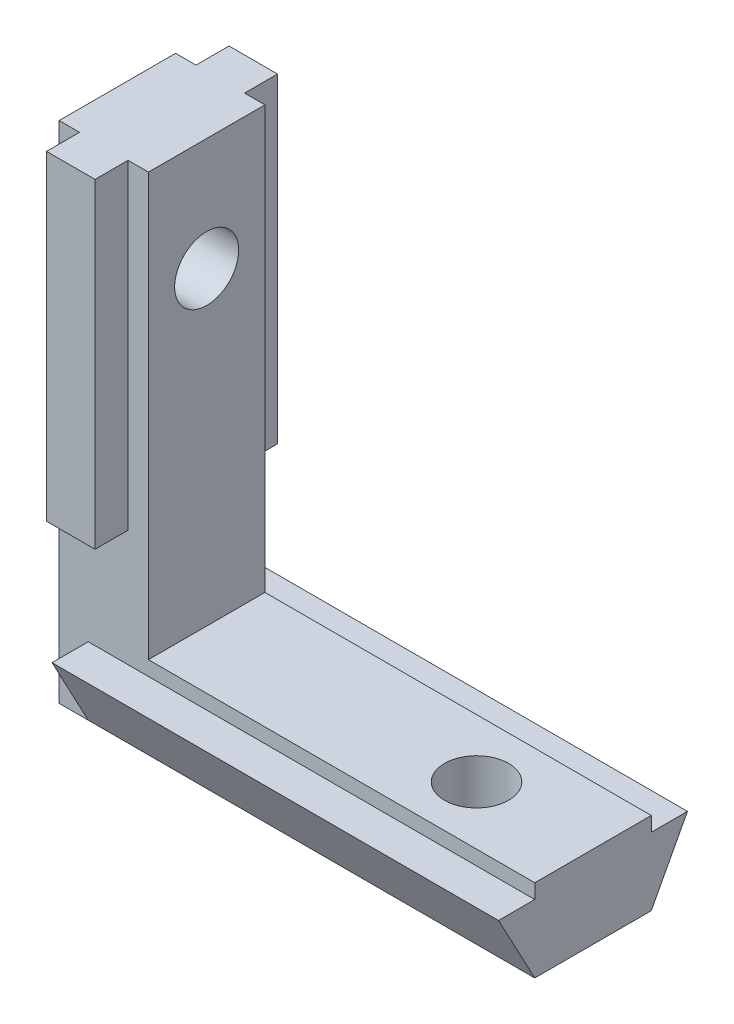
ISO-10303-21;
HEADER;
FILE_DESCRIPTION(('STEP AP214'),'2;1');
FILE_NAME('part.step','',(''),(''),'','','');
FILE_SCHEMA(('AUTOMOTIVE_DESIGN { 1 0 10303 214 1 1 1 1 }'));
ENDSEC;
DATA;
#1=APPLICATION_CONTEXT('core data for automotive mechanical design processes');
#2=APPLICATION_PROTOCOL_DEFINITION('international standard','automotive_design',2000,#1);
#3=PRODUCT_CONTEXT('',#1,'mechanical');
#4=PRODUCT('Part','Part','',(#3));
#5=PRODUCT_RELATED_PRODUCT_CATEGORY('part','',(#4));
#6=PRODUCT_DEFINITION_FORMATION('','',#4);
#7=PRODUCT_DEFINITION_CONTEXT('part definition',#1,'design');
#8=PRODUCT_DEFINITION('design','',#6,#7);
#9=PRODUCT_DEFINITION_SHAPE('','',#8);
#10=(LENGTH_UNIT() NAMED_UNIT(*) SI_UNIT(.MILLI.,.METRE.));
#11=(NAMED_UNIT(*) PLANE_ANGLE_UNIT() SI_UNIT($,.RADIAN.));
#12=(NAMED_UNIT(*) SI_UNIT($,.STERADIAN.) SOLID_ANGLE_UNIT());
#13=UNCERTAINTY_MEASURE_WITH_UNIT(LENGTH_MEASURE(1.E-05),#10,'distance_accuracy_value','');
#14=(GEOMETRIC_REPRESENTATION_CONTEXT(3) GLOBAL_UNCERTAINTY_ASSIGNED_CONTEXT((#13)) GLOBAL_UNIT_ASSIGNED_CONTEXT((#10,
#11,#12)) REPRESENTATION_CONTEXT('',''));
#15=CARTESIAN_POINT('',(0.,0.,0.));
#16=DIRECTION('',(0.,0.,1.));
#17=DIRECTION('',(1.,0.,0.));
#18=AXIS2_PLACEMENT_3D('',#15,#16,#17);
#19=CARTESIAN_POINT('',(25.5,4.25,3.));
#20=DIRECTION('',(0.,-1.,0.));
#21=DIRECTION('',(1.,0.,0.));
#22=AXIS2_PLACEMENT_3D('',#19,#20,#21);
#23=PLANE('',#22);
#24=DIRECTION('',(-1.,0.,0.));
#25=VECTOR('',#24,1.);
#26=CARTESIAN_POINT('',(25.5,4.25,-3.));
#27=LINE('',#26,#25);
#28=CARTESIAN_POINT('',(24.5,4.25,-3.));
#29=VERTEX_POINT('',#28);
#30=CARTESIAN_POINT('',(4.6,4.25,-3.));
#31=VERTEX_POINT('',#30);
#32=EDGE_CURVE('E223',#29,#31,#27,.T.);
#33=ORIENTED_EDGE('',*,*,#32,.T.);
#34=DIRECTION('',(0.,0.,-1.));
#35=VECTOR('',#34,1.);
#36=CARTESIAN_POINT('',(4.6,4.25,5.2));
#37=LINE('',#36,#35);
#38=CARTESIAN_POINT('',(4.6,4.25,3.));
#39=VERTEX_POINT('',#38);
#40=EDGE_CURVE('E239',#39,#31,#37,.T.);
#41=ORIENTED_EDGE('',*,*,#40,.F.);
#42=DIRECTION('',(-1.,0.,0.));
#43=VECTOR('',#42,1.);
#44=CARTESIAN_POINT('',(25.5,4.25,3.));
#45=LINE('',#44,#43);
#46=CARTESIAN_POINT('',(24.5,4.25,3.));
#47=VERTEX_POINT('',#46);
#48=EDGE_CURVE('E227',#47,#39,#45,.T.);
#49=ORIENTED_EDGE('',*,*,#48,.F.);
#50=DIRECTION('',(0.,0.,-1.));
#51=VECTOR('',#50,1.);
#52=CARTESIAN_POINT('',(24.5,4.25,3.));
#53=LINE('',#52,#51);
#54=EDGE_CURVE('E249',#47,#29,#53,.T.);
#55=ORIENTED_EDGE('',*,*,#54,.T.);
#56=EDGE_LOOP('',(#33,#41,#49,#55));
#57=FACE_BOUND('',#56,.T.);
#58=CARTESIAN_POINT('',(18.5,4.25,0.));
#59=DIRECTION('',(0.,1.,0.));
#60=DIRECTION('',(0.,0.,1.));
#61=AXIS2_PLACEMENT_3D('',#58,#59,#60);
#62=CIRCLE('',#61,1.65);
#63=CARTESIAN_POINT('',(18.5,4.25,1.65));
#64=VERTEX_POINT('',#63);
#65=EDGE_CURVE('E231',#64,#64,#62,.T.);
#66=ORIENTED_EDGE('',*,*,#65,.F.);
#67=EDGE_LOOP('',(#66));
#68=FACE_BOUND('',#67,.T.);
#69=ADVANCED_FACE('F44',(#57,#68),#23,.F.);
#70=CARTESIAN_POINT('',(5.,26.,3.));
#71=DIRECTION('',(0.,-1.,0.));
#72=DIRECTION('',(0.,0.,-1.));
#73=AXIS2_PLACEMENT_3D('',#70,#71,#72);
#74=PLANE('',#73);
#75=DIRECTION('',(-1.,0.,0.));
#76=VECTOR('',#75,1.);
#77=CARTESIAN_POINT('',(5.,26.,-3.));
#78=LINE('',#77,#76);
#79=CARTESIAN_POINT('',(4.6,26.,-3.));
#80=VERTEX_POINT('',#79);
#81=CARTESIAN_POINT('',(3.55,26.,-3.));
#82=VERTEX_POINT('',#81);
#83=EDGE_CURVE('E198',#80,#82,#78,.T.);
#84=ORIENTED_EDGE('',*,*,#83,.T.);
#85=DIRECTION('',(0.,0.,-1.));
#86=VECTOR('',#85,1.);
#87=CARTESIAN_POINT('',(3.55,26.,-5.2));
#88=LINE('',#87,#86);
#89=CARTESIAN_POINT('',(3.55,26.,-4.7));
#90=VERTEX_POINT('',#89);
#91=EDGE_CURVE('E262',#82,#90,#88,.T.);
#92=ORIENTED_EDGE('',*,*,#91,.T.);
#93=DIRECTION('',(-1.,0.,0.));
#94=VECTOR('',#93,1.);
#95=CARTESIAN_POINT('',(1.5,26.,-4.7));
#96=LINE('',#95,#94);
#97=CARTESIAN_POINT('',(1.05,26.,-4.7));
#98=VERTEX_POINT('',#97);
#99=EDGE_CURVE('E261',#90,#98,#96,.T.);
#100=ORIENTED_EDGE('',*,*,#99,.T.);
#101=DIRECTION('',(0.,0.,1.));
#102=VECTOR('',#101,1.);
#103=CARTESIAN_POINT('',(1.05,26.,-5.2));
#104=LINE('',#103,#102);
#105=CARTESIAN_POINT('',(1.05,26.,-3.));
#106=VERTEX_POINT('',#105);
#107=EDGE_CURVE('E273',#98,#106,#104,.T.);
#108=ORIENTED_EDGE('',*,*,#107,.T.);
#109=CARTESIAN_POINT('',(0.,26.,-3.));
#110=VERTEX_POINT('',#109);
#111=EDGE_CURVE('E202',#106,#110,#78,.T.);
#112=ORIENTED_EDGE('',*,*,#111,.T.);
#113=DIRECTION('',(0.,0.,-1.));
#114=VECTOR('',#113,1.);
#115=CARTESIAN_POINT('',(0.,26.,3.));
#116=LINE('',#115,#114);
#117=CARTESIAN_POINT('',(0.,26.,3.));
#118=VERTEX_POINT('',#117);
#119=EDGE_CURVE('E212',#118,#110,#116,.T.);
#120=ORIENTED_EDGE('',*,*,#119,.F.);
#121=DIRECTION('',(-1.,0.,0.));
#122=VECTOR('',#121,1.);
#123=CARTESIAN_POINT('',(5.,26.,3.));
#124=LINE('',#123,#122);
#125=CARTESIAN_POINT('',(1.05,26.,3.));
#126=VERTEX_POINT('',#125);
#127=EDGE_CURVE('E191',#126,#118,#124,.T.);
#128=ORIENTED_EDGE('',*,*,#127,.F.);
#129=DIRECTION('',(0.,0.,1.));
#130=VECTOR('',#129,1.);
#131=CARTESIAN_POINT('',(1.05,26.,-5.2));
#132=LINE('',#131,#130);
#133=CARTESIAN_POINT('',(1.05,26.,4.7));
#134=VERTEX_POINT('',#133);
#135=EDGE_CURVE('E271',#126,#134,#132,.T.);
#136=ORIENTED_EDGE('',*,*,#135,.T.);
#137=DIRECTION('',(1.,0.,0.));
#138=VECTOR('',#137,1.);
#139=CARTESIAN_POINT('',(1.5,26.,4.7));
#140=LINE('',#139,#138);
#141=CARTESIAN_POINT('',(3.55,26.,4.7));
#142=VERTEX_POINT('',#141);
#143=EDGE_CURVE('E264',#134,#142,#140,.T.);
#144=ORIENTED_EDGE('',*,*,#143,.T.);
#145=DIRECTION('',(0.,0.,-1.));
#146=VECTOR('',#145,1.);
#147=CARTESIAN_POINT('',(3.55,26.,-5.2));
#148=LINE('',#147,#146);
#149=CARTESIAN_POINT('',(3.55,26.,3.));
#150=VERTEX_POINT('',#149);
#151=EDGE_CURVE('E258',#142,#150,#148,.T.);
#152=ORIENTED_EDGE('',*,*,#151,.T.);
#153=CARTESIAN_POINT('',(4.6,26.,3.));
#154=VERTEX_POINT('',#153);
#155=EDGE_CURVE('E188',#154,#150,#124,.T.);
#156=ORIENTED_EDGE('',*,*,#155,.F.);
#157=DIRECTION('',(0.,0.,-1.));
#158=VECTOR('',#157,1.);
#159=CARTESIAN_POINT('',(4.6,26.,3.));
#160=LINE('',#159,#158);
#161=EDGE_CURVE('E246',#154,#80,#160,.T.);
#162=ORIENTED_EDGE('',*,*,#161,.T.);
#163=EDGE_LOOP('',(#84,#92,#100,#108,#112,#120,#128,#136,#144,#152,#156,#162));
#164=FACE_BOUND('',#163,.T.);
#165=ADVANCED_FACE('F337',(#164),#74,.F.);
#166=CARTESIAN_POINT('',(0.,26.,3.));
#167=DIRECTION('',(1.,0.,0.));
#168=DIRECTION('',(0.,1.,0.));
#169=AXIS2_PLACEMENT_3D('',#166,#167,#168);
#170=PLANE('',#169);
#171=CARTESIAN_POINT('',(0.,20.2,0.));
#172=DIRECTION('',(1.,0.,0.));
#173=DIRECTION('',(0.,0.,-1.));
#174=AXIS2_PLACEMENT_3D('',#171,#172,#173);
#175=CIRCLE('',#174,1.65);
#176=CARTESIAN_POINT('',(0.,20.2,-1.65));
#177=VERTEX_POINT('',#176);
#178=EDGE_CURVE('E235',#177,#177,#175,.T.);
#179=ORIENTED_EDGE('',*,*,#178,.T.);
#180=EDGE_LOOP('',(#179));
#181=FACE_BOUND('',#180,.T.);
#182=DIRECTION('',(0.,-1.,0.));
#183=VECTOR('',#182,1.);
#184=CARTESIAN_POINT('',(0.,26.,-3.));
#185=LINE('',#184,#183);
#186=CARTESIAN_POINT('',(0.,0.,-3.));
#187=VERTEX_POINT('',#186);
#188=EDGE_CURVE('E201',#110,#187,#185,.T.);
#189=ORIENTED_EDGE('',*,*,#188,.T.);
#190=DIRECTION('',(0.,0.,-1.));
#191=VECTOR('',#190,1.);
#192=CARTESIAN_POINT('',(0.,0.,3.));
#193=LINE('',#192,#191);
#194=CARTESIAN_POINT('',(0.,0.,3.));
#195=VERTEX_POINT('',#194);
#196=EDGE_CURVE('E209',#195,#187,#193,.T.);
#197=ORIENTED_EDGE('',*,*,#196,.F.);
#198=DIRECTION('',(0.,-1.,0.));
#199=VECTOR('',#198,1.);
#200=CARTESIAN_POINT('',(0.,26.,3.));
#201=LINE('',#200,#199);
#202=EDGE_CURVE('E190',#118,#195,#201,.T.);
#203=ORIENTED_EDGE('',*,*,#202,.F.);
#204=ORIENTED_EDGE('',*,*,#119,.T.);
#205=EDGE_LOOP('',(#189,#197,#203,#204));
#206=FACE_BOUND('',#205,.T.);
#207=ADVANCED_FACE('F363',(#181,#206),#170,.F.);
#208=CARTESIAN_POINT('',(0.,0.,3.));
#209=DIRECTION('',(0.,1.,0.));
#210=DIRECTION('',(0.,0.,1.));
#211=AXIS2_PLACEMENT_3D('',#208,#209,#210);
#212=PLANE('',#211);
#213=CARTESIAN_POINT('',(18.5,0.,0.));
#214=DIRECTION('',(0.,1.,0.));
#215=DIRECTION('',(0.,0.,1.));
#216=AXIS2_PLACEMENT_3D('',#213,#214,#215);
#217=CIRCLE('',#216,1.65);
#218=CARTESIAN_POINT('',(18.5,0.,1.65));
#219=VERTEX_POINT('',#218);
#220=EDGE_CURVE('E234',#219,#219,#217,.T.);
#221=ORIENTED_EDGE('',*,*,#220,.T.);
#222=EDGE_LOOP('',(#221));
#223=FACE_BOUND('',#222,.T.);
#224=DIRECTION('',(1.,0.,0.));
#225=VECTOR('',#224,1.);
#226=CARTESIAN_POINT('',(1.5,0.,3.));
#227=LINE('',#226,#225);
#228=CARTESIAN_POINT('',(1.49999999999999,0.,3.));
#229=VERTEX_POINT('',#228);
#230=CARTESIAN_POINT('',(24.5,0.,3.));
#231=VERTEX_POINT('',#230);
#232=EDGE_CURVE('E172',#229,#231,#227,.T.);
#233=ORIENTED_EDGE('',*,*,#232,.F.);
#234=DIRECTION('',(1.,0.,0.));
#235=VECTOR('',#234,1.);
#236=CARTESIAN_POINT('',(0.,0.,3.));
#237=LINE('',#236,#235);
#238=EDGE_CURVE('E194',#195,#229,#237,.T.);
#239=ORIENTED_EDGE('',*,*,#238,.F.);
#240=ORIENTED_EDGE('',*,*,#196,.T.);
#241=DIRECTION('',(1.,0.,0.));
#242=VECTOR('',#241,1.);
#243=CARTESIAN_POINT('',(0.,0.,-3.));
#244=LINE('',#243,#242);
#245=CARTESIAN_POINT('',(1.5,0.,-3.));
#246=VERTEX_POINT('',#245);
#247=EDGE_CURVE('E205',#187,#246,#244,.T.);
#248=ORIENTED_EDGE('',*,*,#247,.T.);
#249=DIRECTION('',(1.,0.,0.));
#250=VECTOR('',#249,1.);
#251=CARTESIAN_POINT('',(1.5,0.,-3.));
#252=LINE('',#251,#250);
#253=CARTESIAN_POINT('',(24.5,0.,-3.));
#254=VERTEX_POINT('',#253);
#255=EDGE_CURVE('E177',#246,#254,#252,.T.);
#256=ORIENTED_EDGE('',*,*,#255,.T.);
#257=DIRECTION('',(0.,0.,-1.));
#258=VECTOR('',#257,1.);
#259=CARTESIAN_POINT('',(24.5,0.,3.));
#260=LINE('',#259,#258);
#261=EDGE_CURVE('E213',#231,#254,#260,.T.);
#262=ORIENTED_EDGE('',*,*,#261,.F.);
#263=EDGE_LOOP('',(#233,#239,#240,#248,#256,#262));
#264=FACE_BOUND('',#263,.T.);
#265=ADVANCED_FACE('F382',(#223,#264),#212,.F.);
#266=CARTESIAN_POINT('',(24.5,0.,3.));
#267=DIRECTION('',(-1.,0.,0.));
#268=DIRECTION('',(0.,0.,1.));
#269=AXIS2_PLACEMENT_3D('',#266,#267,#268);
#270=PLANE('',#269);
#271=DIRECTION('',(0.,1.,0.));
#272=VECTOR('',#271,1.);
#273=CARTESIAN_POINT('',(24.5,8.,3.));
#274=LINE('',#273,#272);
#275=CARTESIAN_POINT('',(24.5,3.5,3.));
#276=VERTEX_POINT('',#275);
#277=EDGE_CURVE('E197',#276,#47,#274,.T.);
#278=ORIENTED_EDGE('',*,*,#277,.F.);
#279=DIRECTION('',(0.,0.,1.));
#280=VECTOR('',#279,1.);
#281=CARTESIAN_POINT('',(24.5,3.5,5.));
#282=LINE('',#281,#280);
#283=CARTESIAN_POINT('',(24.5,3.5,4.86666666666667));
#284=VERTEX_POINT('',#283);
#285=EDGE_CURVE('E304',#276,#284,#282,.T.);
#286=ORIENTED_EDGE('',*,*,#285,.T.);
#287=DIRECTION('',(0.,-0.882352941176471,-0.470588235294118));
#288=VECTOR('',#287,1.);
#289=CARTESIAN_POINT('',(24.5,0.,3.));
#290=LINE('',#289,#288);
#291=EDGE_CURVE('E171',#284,#231,#290,.T.);
#292=ORIENTED_EDGE('',*,*,#291,.T.);
#293=ORIENTED_EDGE('',*,*,#261,.T.);
#294=DIRECTION('',(0.,0.882352941176471,-0.470588235294118));
#295=VECTOR('',#294,1.);
#296=CARTESIAN_POINT('',(24.5,0.,-3.));
#297=LINE('',#296,#295);
#298=CARTESIAN_POINT('',(24.5,3.5,-4.86666666666667));
#299=VERTEX_POINT('',#298);
#300=EDGE_CURVE('E270',#254,#299,#297,.T.);
#301=ORIENTED_EDGE('',*,*,#300,.T.);
#302=DIRECTION('',(0.,0.,1.));
#303=VECTOR('',#302,1.);
#304=CARTESIAN_POINT('',(24.5,3.5,5.));
#305=LINE('',#304,#303);
#306=CARTESIAN_POINT('',(24.5,3.5,-3.));
#307=VERTEX_POINT('',#306);
#308=EDGE_CURVE('E307',#299,#307,#305,.T.);
#309=ORIENTED_EDGE('',*,*,#308,.T.);
#310=DIRECTION('',(0.,1.,0.));
#311=VECTOR('',#310,1.);
#312=CARTESIAN_POINT('',(24.5,8.,-3.));
#313=LINE('',#312,#311);
#314=EDGE_CURVE('E208',#307,#29,#313,.T.);
#315=ORIENTED_EDGE('',*,*,#314,.T.);
#316=ORIENTED_EDGE('',*,*,#54,.F.);
#317=EDGE_LOOP('',(#278,#286,#292,#293,#301,#309,#315,#316));
#318=FACE_BOUND('',#317,.T.);
#319=ADVANCED_FACE('F315',(#318),#270,.F.);
#320=CARTESIAN_POINT('',(4.6,8.00000000000002,3.));
#321=DIRECTION('',(-1.,0.,0.));
#322=DIRECTION('',(0.,-1.,0.));
#323=AXIS2_PLACEMENT_3D('',#320,#321,#322);
#324=PLANE('',#323);
#325=CARTESIAN_POINT('',(4.6,20.2,0.));
#326=DIRECTION('',(1.,0.,0.));
#327=DIRECTION('',(0.,0.,-1.));
#328=AXIS2_PLACEMENT_3D('',#325,#326,#327);
#329=CIRCLE('',#328,1.65);
#330=CARTESIAN_POINT('',(4.6,20.2,-1.65));
#331=VERTEX_POINT('',#330);
#332=EDGE_CURVE('E236',#331,#331,#329,.T.);
#333=ORIENTED_EDGE('',*,*,#332,.F.);
#334=EDGE_LOOP('',(#333));
#335=FACE_BOUND('',#334,.T.);
#336=DIRECTION('',(0.,1.,0.));
#337=VECTOR('',#336,1.);
#338=CARTESIAN_POINT('',(4.6,8.00000000000002,-3.));
#339=LINE('',#338,#337);
#340=EDGE_CURVE('E226',#31,#80,#339,.T.);
#341=ORIENTED_EDGE('',*,*,#340,.T.);
#342=ORIENTED_EDGE('',*,*,#161,.F.);
#343=DIRECTION('',(0.,1.,0.));
#344=VECTOR('',#343,1.);
#345=CARTESIAN_POINT('',(4.6,8.00000000000002,3.));
#346=LINE('',#345,#344);
#347=EDGE_CURVE('E230',#39,#154,#346,.T.);
#348=ORIENTED_EDGE('',*,*,#347,.F.);
#349=ORIENTED_EDGE('',*,*,#40,.T.);
#350=EDGE_LOOP('',(#341,#342,#348,#349));
#351=FACE_BOUND('',#350,.T.);
#352=ADVANCED_FACE('F334',(#335,#351),#324,.F.);
#353=CARTESIAN_POINT('',(8.,8.,3.));
#354=DIRECTION('',(0.,0.,-1.));
#355=DIRECTION('',(-1.,0.,0.));
#356=AXIS2_PLACEMENT_3D('',#353,#354,#355);
#357=PLANE('',#356);
#358=ORIENTED_EDGE('',*,*,#48,.T.);
#359=ORIENTED_EDGE('',*,*,#347,.T.);
#360=ORIENTED_EDGE('',*,*,#155,.T.);
#361=DIRECTION('',(0.,-1.,0.));
#362=VECTOR('',#361,1.);
#363=CARTESIAN_POINT('',(3.55,8.,3.));
#364=LINE('',#363,#362);
#365=CARTESIAN_POINT('',(3.55,9.5,3.));
#366=VERTEX_POINT('',#365);
#367=EDGE_CURVE('E63',#150,#366,#364,.T.);
#368=ORIENTED_EDGE('',*,*,#367,.T.);
#369=DIRECTION('',(1.,0.,0.));
#370=VECTOR('',#369,1.);
#371=CARTESIAN_POINT('',(8.,9.5,3.));
#372=LINE('',#371,#370);
#373=CARTESIAN_POINT('',(1.05,9.5,3.));
#374=VERTEX_POINT('',#373);
#375=EDGE_CURVE('E252',#374,#366,#372,.T.);
#376=ORIENTED_EDGE('',*,*,#375,.F.);
#377=DIRECTION('',(0.,1.,0.));
#378=VECTOR('',#377,1.);
#379=CARTESIAN_POINT('',(1.05,8.,3.));
#380=LINE('',#379,#378);
#381=EDGE_CURVE('E251',#374,#126,#380,.T.);
#382=ORIENTED_EDGE('',*,*,#381,.T.);
#383=ORIENTED_EDGE('',*,*,#127,.T.);
#384=ORIENTED_EDGE('',*,*,#202,.T.);
#385=ORIENTED_EDGE('',*,*,#238,.T.);
#386=DIRECTION('',(0.,-1.,0.));
#387=VECTOR('',#386,1.);
#388=CARTESIAN_POINT('',(1.49999999999999,8.,3.));
#389=LINE('',#388,#387);
#390=CARTESIAN_POINT('',(1.49999999999999,3.5,3.));
#391=VERTEX_POINT('',#390);
#392=EDGE_CURVE('E176',#391,#229,#389,.T.);
#393=ORIENTED_EDGE('',*,*,#392,.F.);
#394=DIRECTION('',(1.,0.,0.));
#395=VECTOR('',#394,1.);
#396=CARTESIAN_POINT('',(8.,3.5,3.));
#397=LINE('',#396,#395);
#398=EDGE_CURVE('E159',#391,#276,#397,.T.);
#399=ORIENTED_EDGE('',*,*,#398,.T.);
#400=ORIENTED_EDGE('',*,*,#277,.T.);
#401=EDGE_LOOP('',(#358,#359,#360,#368,#376,#382,#383,#384,#385,#393,#399,#400));
#402=FACE_BOUND('',#401,.T.);
#403=ADVANCED_FACE('F318',(#402),#357,.F.);
#404=CARTESIAN_POINT('',(8.,8.,-3.));
#405=DIRECTION('',(0.,0.,-1.));
#406=DIRECTION('',(-1.,0.,0.));
#407=AXIS2_PLACEMENT_3D('',#404,#405,#406);
#408=PLANE('',#407);
#409=ORIENTED_EDGE('',*,*,#340,.F.);
#410=ORIENTED_EDGE('',*,*,#32,.F.);
#411=ORIENTED_EDGE('',*,*,#314,.F.);
#412=DIRECTION('',(1.,0.,0.));
#413=VECTOR('',#412,1.);
#414=CARTESIAN_POINT('',(8.,3.5,-3.));
#415=LINE('',#414,#413);
#416=CARTESIAN_POINT('',(1.49999999999999,3.5,-3.));
#417=VERTEX_POINT('',#416);
#418=EDGE_CURVE('E219',#417,#307,#415,.T.);
#419=ORIENTED_EDGE('',*,*,#418,.F.);
#420=DIRECTION('',(0.,-1.,0.));
#421=VECTOR('',#420,1.);
#422=CARTESIAN_POINT('',(1.49999999999999,8.,-3.));
#423=LINE('',#422,#421);
#424=EDGE_CURVE('E216',#417,#246,#423,.T.);
#425=ORIENTED_EDGE('',*,*,#424,.T.);
#426=ORIENTED_EDGE('',*,*,#247,.F.);
#427=ORIENTED_EDGE('',*,*,#188,.F.);
#428=ORIENTED_EDGE('',*,*,#111,.F.);
#429=DIRECTION('',(0.,1.,0.));
#430=VECTOR('',#429,1.);
#431=CARTESIAN_POINT('',(1.05,8.,-3.));
#432=LINE('',#431,#430);
#433=CARTESIAN_POINT('',(1.05,9.5,-3.));
#434=VERTEX_POINT('',#433);
#435=EDGE_CURVE('E12',#434,#106,#432,.T.);
#436=ORIENTED_EDGE('',*,*,#435,.F.);
#437=DIRECTION('',(1.,0.,0.));
#438=VECTOR('',#437,1.);
#439=CARTESIAN_POINT('',(8.,9.5,-3.));
#440=LINE('',#439,#438);
#441=CARTESIAN_POINT('',(3.55,9.5,-3.));
#442=VERTEX_POINT('',#441);
#443=EDGE_CURVE('E220',#434,#442,#440,.T.);
#444=ORIENTED_EDGE('',*,*,#443,.T.);
#445=DIRECTION('',(0.,-1.,0.));
#446=VECTOR('',#445,1.);
#447=CARTESIAN_POINT('',(3.55,8.,-3.));
#448=LINE('',#447,#446);
#449=EDGE_CURVE('E54',#82,#442,#448,.T.);
#450=ORIENTED_EDGE('',*,*,#449,.F.);
#451=ORIENTED_EDGE('',*,*,#83,.F.);
#452=EDGE_LOOP('',(#409,#410,#411,#419,#425,#426,#427,#428,#436,#444,#450,#451));
#453=FACE_BOUND('',#452,.T.);
#454=ADVANCED_FACE('F379',(#453),#408,.T.);
#455=CARTESIAN_POINT('',(1.49999999999999,0.,0.));
#456=DIRECTION('',(1.,0.,0.));
#457=DIRECTION('',(0.,0.,-1.));
#458=AXIS2_PLACEMENT_3D('',#455,#456,#457);
#459=PLANE('',#458);
#460=ORIENTED_EDGE('',*,*,#424,.F.);
#461=DIRECTION('',(0.,0.,1.));
#462=VECTOR('',#461,1.);
#463=CARTESIAN_POINT('',(1.49999999999999,3.5,0.));
#464=LINE('',#463,#462);
#465=CARTESIAN_POINT('',(1.5,3.5,-4.86666666666667));
#466=VERTEX_POINT('',#465);
#467=EDGE_CURVE('E163',#466,#417,#464,.T.);
#468=ORIENTED_EDGE('',*,*,#467,.F.);
#469=DIRECTION('',(0.,0.882352941176471,-0.470588235294118));
#470=VECTOR('',#469,1.);
#471=CARTESIAN_POINT('',(1.5,0.,-3.));
#472=LINE('',#471,#470);
#473=EDGE_CURVE('E164',#246,#466,#472,.T.);
#474=ORIENTED_EDGE('',*,*,#473,.F.);
#475=EDGE_LOOP('',(#460,#468,#474));
#476=FACE_BOUND('',#475,.T.);
#477=ADVANCED_FACE('F400',(#476),#459,.F.);
#478=CARTESIAN_POINT('',(1.5,0.,-3.));
#479=DIRECTION('',(0.,-0.470588235294118,-0.882352941176471));
#480=DIRECTION('',(0.,0.882352941176471,-0.470588235294118));
#481=AXIS2_PLACEMENT_3D('',#478,#479,#480);
#482=PLANE('',#481);
#483=ORIENTED_EDGE('',*,*,#300,.F.);
#484=ORIENTED_EDGE('',*,*,#255,.F.);
#485=ORIENTED_EDGE('',*,*,#473,.T.);
#486=DIRECTION('',(1.,0.,0.));
#487=VECTOR('',#486,1.);
#488=CARTESIAN_POINT('',(1.5,3.5,-4.86666666666667));
#489=LINE('',#488,#487);
#490=EDGE_CURVE('E173',#466,#299,#489,.T.);
#491=ORIENTED_EDGE('',*,*,#490,.T.);
#492=EDGE_LOOP('',(#483,#484,#485,#491));
#493=FACE_BOUND('',#492,.T.);
#494=ADVANCED_FACE('F403',(#493),#482,.T.);
#495=CARTESIAN_POINT('',(1.5,3.5,5.));
#496=DIRECTION('',(0.,1.,0.));
#497=DIRECTION('',(0.,0.,1.));
#498=AXIS2_PLACEMENT_3D('',#495,#496,#497);
#499=PLANE('',#498);
#500=ORIENTED_EDGE('',*,*,#467,.T.);
#501=ORIENTED_EDGE('',*,*,#418,.T.);
#502=ORIENTED_EDGE('',*,*,#308,.F.);
#503=ORIENTED_EDGE('',*,*,#490,.F.);
#504=EDGE_LOOP('',(#500,#501,#502,#503));
#505=FACE_BOUND('',#504,.T.);
#506=ADVANCED_FACE('F46',(#505),#499,.T.);
#507=ORIENTED_EDGE('',*,*,#398,.F.);
#508=DIRECTION('',(0.,0.,1.));
#509=VECTOR('',#508,1.);
#510=CARTESIAN_POINT('',(1.49999999999999,3.5,0.));
#511=LINE('',#510,#509);
#512=CARTESIAN_POINT('',(1.5,3.5,4.86666666666667));
#513=VERTEX_POINT('',#512);
#514=EDGE_CURVE('E48',#391,#513,#511,.T.);
#515=ORIENTED_EDGE('',*,*,#514,.T.);
#516=DIRECTION('',(1.,0.,0.));
#517=VECTOR('',#516,1.);
#518=CARTESIAN_POINT('',(1.5,3.5,4.86666666666667));
#519=LINE('',#518,#517);
#520=EDGE_CURVE('E156',#513,#284,#519,.T.);
#521=ORIENTED_EDGE('',*,*,#520,.T.);
#522=ORIENTED_EDGE('',*,*,#285,.F.);
#523=EDGE_LOOP('',(#507,#515,#521,#522));
#524=FACE_BOUND('',#523,.T.);
#525=ADVANCED_FACE('F154',(#524),#499,.T.);
#526=ORIENTED_EDGE('',*,*,#514,.F.);
#527=ORIENTED_EDGE('',*,*,#392,.T.);
#528=DIRECTION('',(0.,-0.882352941176471,-0.470588235294118));
#529=VECTOR('',#528,1.);
#530=CARTESIAN_POINT('',(1.5,0.,3.));
#531=LINE('',#530,#529);
#532=EDGE_CURVE('E169',#513,#229,#531,.T.);
#533=ORIENTED_EDGE('',*,*,#532,.F.);
#534=EDGE_LOOP('',(#526,#527,#533));
#535=FACE_BOUND('',#534,.T.);
#536=ADVANCED_FACE('F174',(#535),#459,.F.);
#537=CARTESIAN_POINT('',(1.5,0.,3.));
#538=DIRECTION('',(0.,-0.470588235294118,0.88235294117647));
#539=DIRECTION('',(0.,-0.882352941176471,-0.470588235294118));
#540=AXIS2_PLACEMENT_3D('',#537,#538,#539);
#541=PLANE('',#540);
#542=ORIENTED_EDGE('',*,*,#291,.F.);
#543=ORIENTED_EDGE('',*,*,#520,.F.);
#544=ORIENTED_EDGE('',*,*,#532,.T.);
#545=ORIENTED_EDGE('',*,*,#232,.T.);
#546=EDGE_LOOP('',(#542,#543,#544,#545));
#547=FACE_BOUND('',#546,.T.);
#548=ADVANCED_FACE('F167',(#547),#541,.T.);
#549=CARTESIAN_POINT('',(1.5,9.5,-4.7));
#550=DIRECTION('',(0.,0.,-1.));
#551=DIRECTION('',(-1.,0.,0.));
#552=AXIS2_PLACEMENT_3D('',#549,#550,#551);
#553=PLANE('',#552);
#554=ORIENTED_EDGE('',*,*,#99,.F.);
#555=DIRECTION('',(0.,1.,0.));
#556=VECTOR('',#555,1.);
#557=CARTESIAN_POINT('',(3.55,9.5,-4.7));
#558=LINE('',#557,#556);
#559=CARTESIAN_POINT('',(3.55,9.5,-4.7));
#560=VERTEX_POINT('',#559);
#561=EDGE_CURVE('E284',#560,#90,#558,.T.);
#562=ORIENTED_EDGE('',*,*,#561,.F.);
#563=DIRECTION('',(-1.,0.,0.));
#564=VECTOR('',#563,1.);
#565=CARTESIAN_POINT('',(0.,9.5,-4.7));
#566=LINE('',#565,#564);
#567=CARTESIAN_POINT('',(1.05,9.5,-4.7));
#568=VERTEX_POINT('',#567);
#569=EDGE_CURVE('E256',#560,#568,#566,.T.);
#570=ORIENTED_EDGE('',*,*,#569,.T.);
#571=DIRECTION('',(0.,1.,0.));
#572=VECTOR('',#571,1.);
#573=CARTESIAN_POINT('',(1.05,9.5,-4.7));
#574=LINE('',#573,#572);
#575=EDGE_CURVE('E292',#568,#98,#574,.T.);
#576=ORIENTED_EDGE('',*,*,#575,.T.);
#577=EDGE_LOOP('',(#554,#562,#570,#576));
#578=FACE_BOUND('',#577,.T.);
#579=ADVANCED_FACE('F409',(#578),#553,.T.);
#580=CARTESIAN_POINT('',(0.,9.5,0.));
#581=DIRECTION('',(0.,1.,0.));
#582=DIRECTION('',(0.,0.,1.));
#583=AXIS2_PLACEMENT_3D('',#580,#581,#582);
#584=PLANE('',#583);
#585=ORIENTED_EDGE('',*,*,#443,.F.);
#586=DIRECTION('',(0.,0.,1.));
#587=VECTOR('',#586,1.);
#588=CARTESIAN_POINT('',(1.05,9.5,-5.2));
#589=LINE('',#588,#587);
#590=EDGE_CURVE('E276',#568,#434,#589,.T.);
#591=ORIENTED_EDGE('',*,*,#590,.F.);
#592=ORIENTED_EDGE('',*,*,#569,.F.);
#593=DIRECTION('',(0.,0.,-1.));
#594=VECTOR('',#593,1.);
#595=CARTESIAN_POINT('',(3.55,9.5,-5.2));
#596=LINE('',#595,#594);
#597=EDGE_CURVE('E257',#442,#560,#596,.T.);
#598=ORIENTED_EDGE('',*,*,#597,.F.);
#599=EDGE_LOOP('',(#585,#591,#592,#598));
#600=FACE_BOUND('',#599,.T.);
#601=ADVANCED_FACE('F413',(#600),#584,.F.);
#602=CARTESIAN_POINT('',(3.55,9.5,-5.2));
#603=DIRECTION('',(1.,0.,0.));
#604=DIRECTION('',(0.,0.,-1.));
#605=AXIS2_PLACEMENT_3D('',#602,#603,#604);
#606=PLANE('',#605);
#607=ORIENTED_EDGE('',*,*,#91,.F.);
#608=ORIENTED_EDGE('',*,*,#449,.T.);
#609=ORIENTED_EDGE('',*,*,#597,.T.);
#610=ORIENTED_EDGE('',*,*,#561,.T.);
#611=EDGE_LOOP('',(#607,#608,#609,#610));
#612=FACE_BOUND('',#611,.T.);
#613=ADVANCED_FACE('F416',(#612),#606,.T.);
#614=CARTESIAN_POINT('',(1.05,9.5,-5.2));
#615=DIRECTION('',(-1.,0.,0.));
#616=DIRECTION('',(0.,0.,1.));
#617=AXIS2_PLACEMENT_3D('',#614,#615,#616);
#618=PLANE('',#617);
#619=ORIENTED_EDGE('',*,*,#590,.T.);
#620=ORIENTED_EDGE('',*,*,#435,.T.);
#621=ORIENTED_EDGE('',*,*,#107,.F.);
#622=ORIENTED_EDGE('',*,*,#575,.F.);
#623=EDGE_LOOP('',(#619,#620,#621,#622));
#624=FACE_BOUND('',#623,.T.);
#625=ADVANCED_FACE('F447',(#624),#618,.T.);
#626=ORIENTED_EDGE('',*,*,#381,.F.);
#627=DIRECTION('',(0.,0.,1.));
#628=VECTOR('',#627,1.);
#629=CARTESIAN_POINT('',(1.05,9.5,-5.2));
#630=LINE('',#629,#628);
#631=CARTESIAN_POINT('',(1.05,9.5,4.7));
#632=VERTEX_POINT('',#631);
#633=EDGE_CURVE('E274',#374,#632,#630,.T.);
#634=ORIENTED_EDGE('',*,*,#633,.T.);
#635=DIRECTION('',(0.,1.,0.));
#636=VECTOR('',#635,1.);
#637=CARTESIAN_POINT('',(1.05,9.5,4.7));
#638=LINE('',#637,#636);
#639=EDGE_CURVE('E285',#632,#134,#638,.T.);
#640=ORIENTED_EDGE('',*,*,#639,.T.);
#641=ORIENTED_EDGE('',*,*,#135,.F.);
#642=EDGE_LOOP('',(#626,#634,#640,#641));
#643=FACE_BOUND('',#642,.T.);
#644=ADVANCED_FACE('F353',(#643),#618,.T.);
#645=ORIENTED_EDGE('',*,*,#367,.F.);
#646=ORIENTED_EDGE('',*,*,#151,.F.);
#647=DIRECTION('',(0.,1.,0.));
#648=VECTOR('',#647,1.);
#649=CARTESIAN_POINT('',(3.55,9.5,4.7));
#650=LINE('',#649,#648);
#651=CARTESIAN_POINT('',(3.55,9.5,4.7));
#652=VERTEX_POINT('',#651);
#653=EDGE_CURVE('E282',#652,#142,#650,.T.);
#654=ORIENTED_EDGE('',*,*,#653,.F.);
#655=DIRECTION('',(0.,0.,-1.));
#656=VECTOR('',#655,1.);
#657=CARTESIAN_POINT('',(3.55,9.5,-5.2));
#658=LINE('',#657,#656);
#659=EDGE_CURVE('E253',#652,#366,#658,.T.);
#660=ORIENTED_EDGE('',*,*,#659,.T.);
#661=EDGE_LOOP('',(#645,#646,#654,#660));
#662=FACE_BOUND('',#661,.T.);
#663=ADVANCED_FACE('F341',(#662),#606,.T.);
#664=ORIENTED_EDGE('',*,*,#633,.F.);
#665=ORIENTED_EDGE('',*,*,#375,.T.);
#666=ORIENTED_EDGE('',*,*,#659,.F.);
#667=DIRECTION('',(1.,0.,0.));
#668=VECTOR('',#667,1.);
#669=CARTESIAN_POINT('',(0.,9.5,4.7));
#670=LINE('',#669,#668);
#671=EDGE_CURVE('E266',#632,#652,#670,.T.);
#672=ORIENTED_EDGE('',*,*,#671,.F.);
#673=EDGE_LOOP('',(#664,#665,#666,#672));
#674=FACE_BOUND('',#673,.T.);
#675=ADVANCED_FACE('F346',(#674),#584,.F.);
#676=CARTESIAN_POINT('',(1.5,9.5,4.7));
#677=DIRECTION('',(0.,0.,1.));
#678=DIRECTION('',(1.,0.,0.));
#679=AXIS2_PLACEMENT_3D('',#676,#677,#678);
#680=PLANE('',#679);
#681=ORIENTED_EDGE('',*,*,#143,.F.);
#682=ORIENTED_EDGE('',*,*,#639,.F.);
#683=ORIENTED_EDGE('',*,*,#671,.T.);
#684=ORIENTED_EDGE('',*,*,#653,.T.);
#685=EDGE_LOOP('',(#681,#682,#683,#684));
#686=FACE_BOUND('',#685,.T.);
#687=ADVANCED_FACE('F349',(#686),#680,.T.);
#688=CARTESIAN_POINT('',(18.5,5.,0.));
#689=DIRECTION('',(0.,1.,0.));
#690=DIRECTION('',(0.,0.,1.));
#691=AXIS2_PLACEMENT_3D('',#688,#689,#690);
#692=CYLINDRICAL_SURFACE('',#691,1.65);
#693=ORIENTED_EDGE('',*,*,#220,.F.);
#694=EDGE_LOOP('',(#693));
#695=FACE_BOUND('',#694,.T.);
#696=ORIENTED_EDGE('',*,*,#65,.T.);
#697=EDGE_LOOP('',(#696));
#698=FACE_BOUND('',#697,.T.);
#699=ADVANCED_FACE('F369',(#695,#698),#692,.F.);
#700=CARTESIAN_POINT('',(5.,20.2,0.));
#701=DIRECTION('',(1.,0.,0.));
#702=DIRECTION('',(0.,0.,-1.));
#703=AXIS2_PLACEMENT_3D('',#700,#701,#702);
#704=CYLINDRICAL_SURFACE('',#703,1.65);
#705=ORIENTED_EDGE('',*,*,#178,.F.);
#706=EDGE_LOOP('',(#705));
#707=FACE_BOUND('',#706,.T.);
#708=ORIENTED_EDGE('',*,*,#332,.T.);
#709=EDGE_LOOP('',(#708));
#710=FACE_BOUND('',#709,.T.);
#711=ADVANCED_FACE('F366',(#707,#710),#704,.F.);
#712=CLOSED_SHELL('',(#69,#165,#207,#265,#319,#352,#403,#454,#477,#494,#506,#525,#536,#548,#579,
#601,#613,#625,#644,#663,#675,#687,#699,#711));
#713=MANIFOLD_SOLID_BREP('B2',#712);
#714=ADVANCED_BREP_SHAPE_REPRESENTATION('',(#18,#713),#14);
#715=SHAPE_DEFINITION_REPRESENTATION(#9,#714);
ENDSEC;
END-ISO-10303-21;
